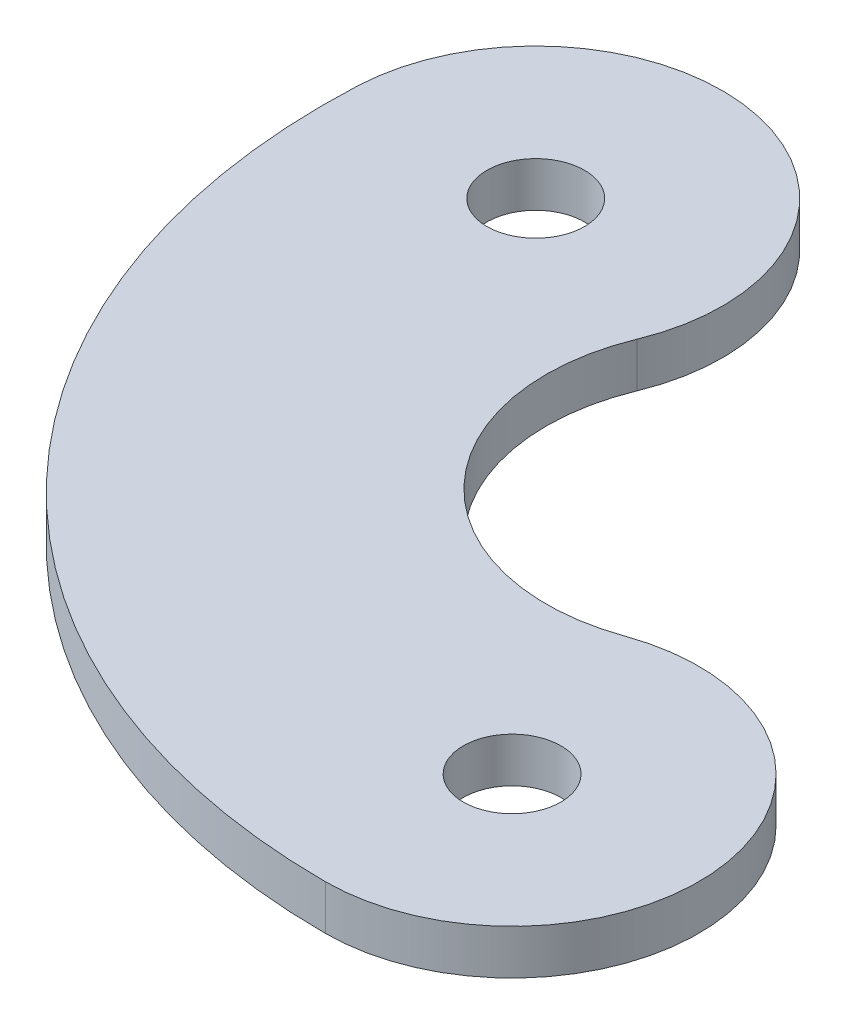
ISO-10303-21;
HEADER;
FILE_DESCRIPTION(('STEP AP214'),'2;1');
FILE_NAME('part.step','',(''),(''),'','','');
FILE_SCHEMA(('AUTOMOTIVE_DESIGN { 1 0 10303 214 1 1 1 1 }'));
ENDSEC;
DATA;
#1=APPLICATION_CONTEXT('core data for automotive mechanical design processes');
#2=APPLICATION_PROTOCOL_DEFINITION('international standard','automotive_design',2000,#1);
#3=PRODUCT_CONTEXT('',#1,'mechanical');
#4=PRODUCT('Part','Part','',(#3));
#5=PRODUCT_RELATED_PRODUCT_CATEGORY('part','',(#4));
#6=PRODUCT_DEFINITION_FORMATION('','',#4);
#7=PRODUCT_DEFINITION_CONTEXT('part definition',#1,'design');
#8=PRODUCT_DEFINITION('design','',#6,#7);
#9=PRODUCT_DEFINITION_SHAPE('','',#8);
#10=(LENGTH_UNIT() NAMED_UNIT(*) SI_UNIT(.MILLI.,.METRE.));
#11=(NAMED_UNIT(*) PLANE_ANGLE_UNIT() SI_UNIT($,.RADIAN.));
#12=(NAMED_UNIT(*) SI_UNIT($,.STERADIAN.) SOLID_ANGLE_UNIT());
#13=UNCERTAINTY_MEASURE_WITH_UNIT(LENGTH_MEASURE(1.E-05),#10,'distance_accuracy_value','');
#14=(GEOMETRIC_REPRESENTATION_CONTEXT(3) GLOBAL_UNCERTAINTY_ASSIGNED_CONTEXT((#13)) GLOBAL_UNIT_ASSIGNED_CONTEXT((#10,
#11,#12)) REPRESENTATION_CONTEXT('',''));
#15=CARTESIAN_POINT('',(0.,0.,0.));
#16=DIRECTION('',(0.,0.,1.));
#17=DIRECTION('',(1.,0.,0.));
#18=AXIS2_PLACEMENT_3D('',#15,#16,#17);
#19=CARTESIAN_POINT('',(293.834252828212,4.572,-226.437806050808));
#20=DIRECTION('',(0.,1.,0.));
#21=DIRECTION('',(0.,0.,-1.));
#22=AXIS2_PLACEMENT_3D('',#19,#20,#21);
#23=PLANE('',#22);
#24=CARTESIAN_POINT('',(309.5625,4.572,-204.1525));
#25=DIRECTION('',(0.,1.,0.));
#26=DIRECTION('',(0.,0.,1.));
#27=AXIS2_PLACEMENT_3D('',#24,#25,#26);
#28=CIRCLE('',#27,2.48920000000002);
#29=CARTESIAN_POINT('',(309.5625,4.572,-201.6633));
#30=VERTEX_POINT('',#29);
#31=EDGE_CURVE('E185',#30,#30,#28,.T.);
#32=ORIENTED_EDGE('',*,*,#31,.F.);
#33=EDGE_LOOP('',(#32));
#34=FACE_BOUND('',#33,.T.);
#35=CARTESIAN_POINT('',(302.934505656425,4.572,-222.688112101615));
#36=DIRECTION('',(0.,-1.,0.));
#37=DIRECTION('',(0.,0.,-1.));
#38=AXIS2_PLACEMENT_3D('',#35,#36,#37);
#39=CIRCLE('',#38,10.16);
#40=CARTESIAN_POINT('',(306.355405962786,4.572,-213.121344565298));
#41=VERTEX_POINT('',#40);
#42=CARTESIAN_POINT('',(293.540696285367,4.572,-226.558763920136));
#43=VERTEX_POINT('',#42);
#44=EDGE_CURVE('E100',#41,#43,#39,.T.);
#45=ORIENTED_EDGE('',*,*,#44,.T.);
#46=CARTESIAN_POINT('',(284.734,4.572,-230.1875));
#47=DIRECTION('',(0.,1.,0.));
#48=DIRECTION('',(0.,0.,1.));
#49=AXIS2_PLACEMENT_3D('',#46,#47,#48);
#50=CIRCLE('',#49,9.52500000000001);
#51=CARTESIAN_POINT('',(275.219712549964,4.572,-230.639118553746));
#52=VERTEX_POINT('',#51);
#53=EDGE_CURVE('E103',#43,#52,#50,.T.);
#54=ORIENTED_EDGE('',*,*,#53,.T.);
#55=CARTESIAN_POINT('',(309.5625,4.572,-229.008955487805));
#56=DIRECTION('',(0.,1.,0.));
#57=DIRECTION('',(0.,0.,1.));
#58=AXIS2_PLACEMENT_3D('',#55,#56,#57);
#59=CIRCLE('',#58,34.3814554878049);
#60=CARTESIAN_POINT('',(309.5625,4.572,-194.6275));
#61=VERTEX_POINT('',#60);
#62=EDGE_CURVE('E87',#52,#61,#59,.T.);
#63=ORIENTED_EDGE('',*,*,#62,.T.);
#64=CARTESIAN_POINT('',(309.5625,4.572,-204.1525));
#65=DIRECTION('',(0.,1.,0.));
#66=DIRECTION('',(0.,0.,1.));
#67=AXIS2_PLACEMENT_3D('',#64,#65,#66);
#68=CIRCLE('',#67,9.52500000000001);
#69=EDGE_CURVE('E95',#61,#41,#68,.T.);
#70=ORIENTED_EDGE('',*,*,#69,.T.);
#71=EDGE_LOOP('',(#45,#54,#63,#70));
#72=FACE_BOUND('',#71,.T.);
#73=CARTESIAN_POINT('',(284.734,4.572,-230.1875));
#74=DIRECTION('',(0.,1.,0.));
#75=DIRECTION('',(0.,0.,1.));
#76=AXIS2_PLACEMENT_3D('',#73,#74,#75);
#77=CIRCLE('',#76,2.48920000000002);
#78=CARTESIAN_POINT('',(284.734,4.572,-227.6983));
#79=VERTEX_POINT('',#78);
#80=EDGE_CURVE('E104',#79,#79,#77,.T.);
#81=ORIENTED_EDGE('',*,*,#80,.F.);
#82=EDGE_LOOP('',(#81));
#83=FACE_BOUND('',#82,.T.);
#84=ADVANCED_FACE('F36',(#34,#72,#83),#23,.T.);
#85=CARTESIAN_POINT('',(302.934505656425,2.286,-222.688112101615));
#86=DIRECTION('',(0.,1.,0.));
#87=DIRECTION('',(0.,0.,-1.));
#88=AXIS2_PLACEMENT_3D('',#85,#86,#87);
#89=CYLINDRICAL_SURFACE('',#88,10.16);
#90=ORIENTED_EDGE('',*,*,#44,.F.);
#91=DIRECTION('',(0.,1.,0.));
#92=VECTOR('',#91,1.);
#93=CARTESIAN_POINT('',(306.355405962786,2.286,-213.121344565298));
#94=LINE('',#93,#92);
#95=CARTESIAN_POINT('',(306.355405962786,2.286,-213.121344565298));
#96=VERTEX_POINT('',#95);
#97=EDGE_CURVE('E72',#96,#41,#94,.T.);
#98=ORIENTED_EDGE('',*,*,#97,.F.);
#99=CARTESIAN_POINT('',(302.934505656425,2.286,-222.688112101615));
#100=DIRECTION('',(0.,-1.,0.));
#101=DIRECTION('',(0.,0.,-1.));
#102=AXIS2_PLACEMENT_3D('',#99,#100,#101);
#103=CIRCLE('',#102,10.16);
#104=CARTESIAN_POINT('',(293.540696285367,2.286,-226.558763920136));
#105=VERTEX_POINT('',#104);
#106=EDGE_CURVE('E93',#96,#105,#103,.T.);
#107=ORIENTED_EDGE('',*,*,#106,.T.);
#108=DIRECTION('',(0.,1.,0.));
#109=VECTOR('',#108,1.);
#110=CARTESIAN_POINT('',(293.540696285367,2.286,-226.558763920136));
#111=LINE('',#110,#109);
#112=EDGE_CURVE('E11',#105,#43,#111,.T.);
#113=ORIENTED_EDGE('',*,*,#112,.T.);
#114=EDGE_LOOP('',(#90,#98,#107,#113));
#115=FACE_BOUND('',#114,.T.);
#116=ADVANCED_FACE('F38',(#115),#89,.F.);
#117=CARTESIAN_POINT('',(284.734,2.286,-230.1875));
#118=DIRECTION('',(0.,1.,0.));
#119=DIRECTION('',(0.,0.,-1.));
#120=AXIS2_PLACEMENT_3D('',#117,#118,#119);
#121=CYLINDRICAL_SURFACE('',#120,9.52500000000001);
#122=ORIENTED_EDGE('',*,*,#53,.F.);
#123=ORIENTED_EDGE('',*,*,#112,.F.);
#124=CARTESIAN_POINT('',(284.734,2.286,-230.1875));
#125=DIRECTION('',(0.,1.,0.));
#126=DIRECTION('',(0.,0.,1.));
#127=AXIS2_PLACEMENT_3D('',#124,#125,#126);
#128=CIRCLE('',#127,9.52500000000001);
#129=CARTESIAN_POINT('',(275.219712549964,2.286,-230.639118553746));
#130=VERTEX_POINT('',#129);
#131=EDGE_CURVE('E79',#105,#130,#128,.T.);
#132=ORIENTED_EDGE('',*,*,#131,.T.);
#133=DIRECTION('',(0.,1.,0.));
#134=VECTOR('',#133,1.);
#135=CARTESIAN_POINT('',(275.219712549964,2.286,-230.639118553746));
#136=LINE('',#135,#134);
#137=EDGE_CURVE('E45',#130,#52,#136,.T.);
#138=ORIENTED_EDGE('',*,*,#137,.T.);
#139=EDGE_LOOP('',(#122,#123,#132,#138));
#140=FACE_BOUND('',#139,.T.);
#141=ADVANCED_FACE('F91',(#140),#121,.T.);
#142=CARTESIAN_POINT('',(309.5625,2.286,-229.008955487805));
#143=DIRECTION('',(0.,1.,0.));
#144=DIRECTION('',(0.,0.,-1.));
#145=AXIS2_PLACEMENT_3D('',#142,#143,#144);
#146=CYLINDRICAL_SURFACE('',#145,34.3814554878049);
#147=ORIENTED_EDGE('',*,*,#62,.F.);
#148=ORIENTED_EDGE('',*,*,#137,.F.);
#149=CARTESIAN_POINT('',(309.5625,2.286,-229.008955487805));
#150=DIRECTION('',(0.,1.,0.));
#151=DIRECTION('',(0.,0.,1.));
#152=AXIS2_PLACEMENT_3D('',#149,#150,#151);
#153=CIRCLE('',#152,34.3814554878049);
#154=CARTESIAN_POINT('',(309.5625,2.286,-194.6275));
#155=VERTEX_POINT('',#154);
#156=EDGE_CURVE('E81',#130,#155,#153,.T.);
#157=ORIENTED_EDGE('',*,*,#156,.T.);
#158=DIRECTION('',(0.,1.,0.));
#159=VECTOR('',#158,1.);
#160=CARTESIAN_POINT('',(309.5625,2.286,-194.6275));
#161=LINE('',#160,#159);
#162=EDGE_CURVE('E68',#155,#61,#161,.T.);
#163=ORIENTED_EDGE('',*,*,#162,.T.);
#164=EDGE_LOOP('',(#147,#148,#157,#163));
#165=FACE_BOUND('',#164,.T.);
#166=ADVANCED_FACE('F85',(#165),#146,.T.);
#167=CARTESIAN_POINT('',(309.5625,2.286,-204.1525));
#168=DIRECTION('',(0.,1.,0.));
#169=DIRECTION('',(0.,0.,-1.));
#170=AXIS2_PLACEMENT_3D('',#167,#168,#169);
#171=CYLINDRICAL_SURFACE('',#170,9.52500000000001);
#172=ORIENTED_EDGE('',*,*,#69,.F.);
#173=ORIENTED_EDGE('',*,*,#162,.F.);
#174=CARTESIAN_POINT('',(309.5625,2.286,-204.1525));
#175=DIRECTION('',(0.,1.,0.));
#176=DIRECTION('',(0.,0.,1.));
#177=AXIS2_PLACEMENT_3D('',#174,#175,#176);
#178=CIRCLE('',#177,9.52500000000001);
#179=EDGE_CURVE('E53',#155,#96,#178,.T.);
#180=ORIENTED_EDGE('',*,*,#179,.T.);
#181=ORIENTED_EDGE('',*,*,#97,.T.);
#182=EDGE_LOOP('',(#172,#173,#180,#181));
#183=FACE_BOUND('',#182,.T.);
#184=ADVANCED_FACE('F126',(#183),#171,.T.);
#185=CARTESIAN_POINT('',(293.834252828212,2.286,-226.437806050808));
#186=DIRECTION('',(0.,1.,0.));
#187=DIRECTION('',(0.,0.,-1.));
#188=AXIS2_PLACEMENT_3D('',#185,#186,#187);
#189=PLANE('',#188);
#190=CARTESIAN_POINT('',(309.5625,2.286,-204.1525));
#191=DIRECTION('',(0.,1.,0.));
#192=DIRECTION('',(0.,0.,1.));
#193=AXIS2_PLACEMENT_3D('',#190,#191,#192);
#194=CIRCLE('',#193,2.48920000000002);
#195=CARTESIAN_POINT('',(309.5625,2.286,-201.6633));
#196=VERTEX_POINT('',#195);
#197=EDGE_CURVE('E188',#196,#196,#194,.T.);
#198=ORIENTED_EDGE('',*,*,#197,.T.);
#199=EDGE_LOOP('',(#198));
#200=FACE_BOUND('',#199,.T.);
#201=CARTESIAN_POINT('',(284.734,2.286,-230.1875));
#202=DIRECTION('',(0.,1.,0.));
#203=DIRECTION('',(0.,0.,1.));
#204=AXIS2_PLACEMENT_3D('',#201,#202,#203);
#205=CIRCLE('',#204,2.48920000000002);
#206=CARTESIAN_POINT('',(284.734,2.286,-227.6983));
#207=VERTEX_POINT('',#206);
#208=EDGE_CURVE('E190',#207,#207,#205,.T.);
#209=ORIENTED_EDGE('',*,*,#208,.T.);
#210=EDGE_LOOP('',(#209));
#211=FACE_BOUND('',#210,.T.);
#212=ORIENTED_EDGE('',*,*,#106,.F.);
#213=ORIENTED_EDGE('',*,*,#179,.F.);
#214=ORIENTED_EDGE('',*,*,#156,.F.);
#215=ORIENTED_EDGE('',*,*,#131,.F.);
#216=EDGE_LOOP('',(#212,#213,#214,#215));
#217=FACE_BOUND('',#216,.T.);
#218=ADVANCED_FACE('F83',(#200,#211,#217),#189,.F.);
#219=CARTESIAN_POINT('',(284.734,2.286,-230.1875));
#220=DIRECTION('',(0.,-1.,0.));
#221=DIRECTION('',(0.,0.,1.));
#222=AXIS2_PLACEMENT_3D('',#219,#220,#221);
#223=CYLINDRICAL_SURFACE('',#222,2.48920000000002);
#224=ORIENTED_EDGE('',*,*,#80,.T.);
#225=EDGE_LOOP('',(#224));
#226=FACE_BOUND('',#225,.T.);
#227=ORIENTED_EDGE('',*,*,#208,.F.);
#228=EDGE_LOOP('',(#227));
#229=FACE_BOUND('',#228,.T.);
#230=ADVANCED_FACE('F144',(#226,#229),#223,.F.);
#231=CARTESIAN_POINT('',(309.5625,2.286,-204.1525));
#232=DIRECTION('',(0.,-1.,0.));
#233=DIRECTION('',(0.,0.,1.));
#234=AXIS2_PLACEMENT_3D('',#231,#232,#233);
#235=CYLINDRICAL_SURFACE('',#234,2.48920000000002);
#236=ORIENTED_EDGE('',*,*,#31,.T.);
#237=EDGE_LOOP('',(#236));
#238=FACE_BOUND('',#237,.T.);
#239=ORIENTED_EDGE('',*,*,#197,.F.);
#240=EDGE_LOOP('',(#239));
#241=FACE_BOUND('',#240,.T.);
#242=ADVANCED_FACE('F151',(#238,#241),#235,.F.);
#243=CLOSED_SHELL('',(#84,#116,#141,#166,#184,#218,#230,#242));
#244=MANIFOLD_SOLID_BREP('B2',#243);
#245=ADVANCED_BREP_SHAPE_REPRESENTATION('',(#18,#244),#14);
#246=SHAPE_DEFINITION_REPRESENTATION(#9,#245);
ENDSEC;
END-ISO-10303-21;
